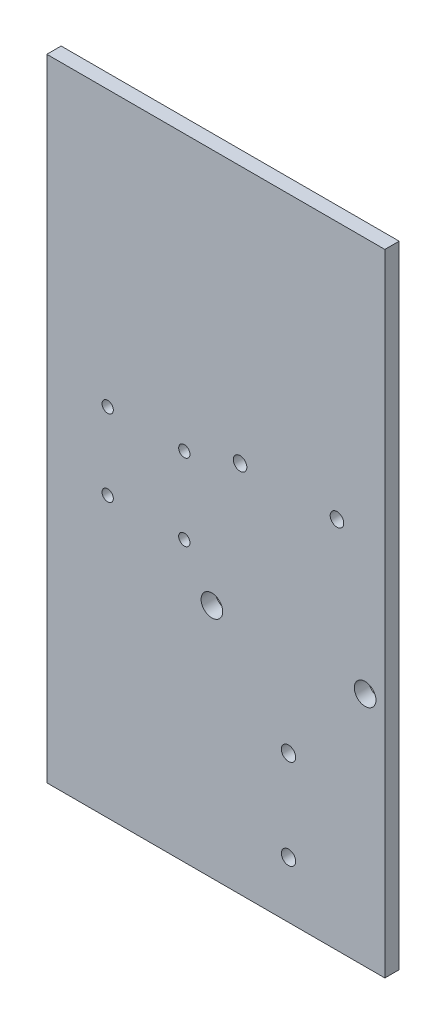
ISO-10303-21;
HEADER;
FILE_DESCRIPTION(('STEP AP214'),'2;1');
FILE_NAME('part.step','',(''),(''),'','','');
FILE_SCHEMA(('AUTOMOTIVE_DESIGN { 1 0 10303 214 1 1 1 1 }'));
ENDSEC;
DATA;
#1=APPLICATION_CONTEXT('core data for automotive mechanical design processes');
#2=APPLICATION_PROTOCOL_DEFINITION('international standard','automotive_design',2000,#1);
#3=PRODUCT_CONTEXT('',#1,'mechanical');
#4=PRODUCT('Part','Part','',(#3));
#5=PRODUCT_RELATED_PRODUCT_CATEGORY('part','',(#4));
#6=PRODUCT_DEFINITION_FORMATION('','',#4);
#7=PRODUCT_DEFINITION_CONTEXT('part definition',#1,'design');
#8=PRODUCT_DEFINITION('design','',#6,#7);
#9=PRODUCT_DEFINITION_SHAPE('','',#8);
#10=(LENGTH_UNIT() NAMED_UNIT(*) SI_UNIT(.MILLI.,.METRE.));
#11=(NAMED_UNIT(*) PLANE_ANGLE_UNIT() SI_UNIT($,.RADIAN.));
#12=(NAMED_UNIT(*) SI_UNIT($,.STERADIAN.) SOLID_ANGLE_UNIT());
#13=UNCERTAINTY_MEASURE_WITH_UNIT(LENGTH_MEASURE(1.E-05),#10,'distance_accuracy_value','');
#14=(GEOMETRIC_REPRESENTATION_CONTEXT(3) GLOBAL_UNCERTAINTY_ASSIGNED_CONTEXT((#13)) GLOBAL_UNIT_ASSIGNED_CONTEXT((#10,
#11,#12)) REPRESENTATION_CONTEXT('',''));
#15=CARTESIAN_POINT('',(0.,0.,0.));
#16=DIRECTION('',(0.,0.,1.));
#17=DIRECTION('',(1.,0.,0.));
#18=AXIS2_PLACEMENT_3D('',#15,#16,#17);
#19=CARTESIAN_POINT('',(0.,0.,6.35));
#20=DIRECTION('',(1.,0.,0.));
#21=DIRECTION('',(0.,1.,0.));
#22=AXIS2_PLACEMENT_3D('',#19,#20,#21);
#23=PLANE('',#22);
#24=DIRECTION('',(0.,-1.,0.));
#25=VECTOR('',#24,1.);
#26=CARTESIAN_POINT('',(0.,0.,0.));
#27=LINE('',#26,#25);
#28=CARTESIAN_POINT('',(0.,280.,0.));
#29=VERTEX_POINT('',#28);
#30=CARTESIAN_POINT('',(0.,0.,0.));
#31=VERTEX_POINT('',#30);
#32=EDGE_CURVE('E101',#29,#31,#27,.T.);
#33=ORIENTED_EDGE('',*,*,#32,.T.);
#34=DIRECTION('',(0.,0.,-1.));
#35=VECTOR('',#34,1.);
#36=CARTESIAN_POINT('',(0.,0.,6.35));
#37=LINE('',#36,#35);
#38=CARTESIAN_POINT('',(0.,0.,6.35));
#39=VERTEX_POINT('',#38);
#40=EDGE_CURVE('E11',#39,#31,#37,.T.);
#41=ORIENTED_EDGE('',*,*,#40,.F.);
#42=DIRECTION('',(0.,-1.,0.));
#43=VECTOR('',#42,1.);
#44=CARTESIAN_POINT('',(0.,0.,6.35));
#45=LINE('',#44,#43);
#46=CARTESIAN_POINT('',(0.,280.,6.35));
#47=VERTEX_POINT('',#46);
#48=EDGE_CURVE('E89',#47,#39,#45,.T.);
#49=ORIENTED_EDGE('',*,*,#48,.F.);
#50=DIRECTION('',(0.,0.,-1.));
#51=VECTOR('',#50,1.);
#52=CARTESIAN_POINT('',(0.,280.,6.35));
#53=LINE('',#52,#51);
#54=EDGE_CURVE('E97',#47,#29,#53,.T.);
#55=ORIENTED_EDGE('',*,*,#54,.T.);
#56=EDGE_LOOP('',(#33,#41,#49,#55));
#57=FACE_BOUND('',#56,.T.);
#58=ADVANCED_FACE('F38',(#57),#23,.F.);
#59=CARTESIAN_POINT('',(0.,0.,6.35));
#60=DIRECTION('',(0.,1.,0.));
#61=DIRECTION('',(0.,0.,1.));
#62=AXIS2_PLACEMENT_3D('',#59,#60,#61);
#63=PLANE('',#62);
#64=DIRECTION('',(1.,0.,0.));
#65=VECTOR('',#64,1.);
#66=CARTESIAN_POINT('',(0.,0.,0.));
#67=LINE('',#66,#65);
#68=CARTESIAN_POINT('',(150.,0.,0.));
#69=VERTEX_POINT('',#68);
#70=EDGE_CURVE('E93',#31,#69,#67,.T.);
#71=ORIENTED_EDGE('',*,*,#70,.T.);
#72=DIRECTION('',(0.,0.,-1.));
#73=VECTOR('',#72,1.);
#74=CARTESIAN_POINT('',(150.,0.,6.35));
#75=LINE('',#74,#73);
#76=CARTESIAN_POINT('',(150.,0.,6.35));
#77=VERTEX_POINT('',#76);
#78=EDGE_CURVE('E46',#77,#69,#75,.T.);
#79=ORIENTED_EDGE('',*,*,#78,.F.);
#80=DIRECTION('',(1.,0.,0.));
#81=VECTOR('',#80,1.);
#82=CARTESIAN_POINT('',(0.,0.,6.35));
#83=LINE('',#82,#81);
#84=EDGE_CURVE('E84',#39,#77,#83,.T.);
#85=ORIENTED_EDGE('',*,*,#84,.F.);
#86=ORIENTED_EDGE('',*,*,#40,.T.);
#87=EDGE_LOOP('',(#71,#79,#85,#86));
#88=FACE_BOUND('',#87,.T.);
#89=ADVANCED_FACE('F92',(#88),#63,.F.);
#90=CARTESIAN_POINT('',(150.,0.,6.35));
#91=DIRECTION('',(-1.,0.,0.));
#92=DIRECTION('',(0.,-1.,0.));
#93=AXIS2_PLACEMENT_3D('',#90,#91,#92);
#94=PLANE('',#93);
#95=DIRECTION('',(0.,1.,0.));
#96=VECTOR('',#95,1.);
#97=CARTESIAN_POINT('',(150.,0.,0.));
#98=LINE('',#97,#96);
#99=CARTESIAN_POINT('',(150.,280.,0.));
#100=VERTEX_POINT('',#99);
#101=EDGE_CURVE('E71',#69,#100,#98,.T.);
#102=ORIENTED_EDGE('',*,*,#101,.T.);
#103=DIRECTION('',(0.,0.,-1.));
#104=VECTOR('',#103,1.);
#105=CARTESIAN_POINT('',(150.,280.,6.35));
#106=LINE('',#105,#104);
#107=CARTESIAN_POINT('',(150.,280.,6.35));
#108=VERTEX_POINT('',#107);
#109=EDGE_CURVE('E94',#108,#100,#106,.T.);
#110=ORIENTED_EDGE('',*,*,#109,.F.);
#111=DIRECTION('',(0.,1.,0.));
#112=VECTOR('',#111,1.);
#113=CARTESIAN_POINT('',(150.,0.,6.35));
#114=LINE('',#113,#112);
#115=EDGE_CURVE('E87',#77,#108,#114,.T.);
#116=ORIENTED_EDGE('',*,*,#115,.F.);
#117=ORIENTED_EDGE('',*,*,#78,.T.);
#118=EDGE_LOOP('',(#102,#110,#116,#117));
#119=FACE_BOUND('',#118,.T.);
#120=ADVANCED_FACE('F95',(#119),#94,.F.);
#121=CARTESIAN_POINT('',(0.,280.,6.35));
#122=DIRECTION('',(0.,-1.,0.));
#123=DIRECTION('',(0.,0.,-1.));
#124=AXIS2_PLACEMENT_3D('',#121,#122,#123);
#125=PLANE('',#124);
#126=DIRECTION('',(-1.,0.,0.));
#127=VECTOR('',#126,1.);
#128=CARTESIAN_POINT('',(0.,280.,0.));
#129=LINE('',#128,#127);
#130=EDGE_CURVE('E77',#100,#29,#129,.T.);
#131=ORIENTED_EDGE('',*,*,#130,.T.);
#132=ORIENTED_EDGE('',*,*,#54,.F.);
#133=DIRECTION('',(-1.,0.,0.));
#134=VECTOR('',#133,1.);
#135=CARTESIAN_POINT('',(0.,280.,6.35));
#136=LINE('',#135,#134);
#137=EDGE_CURVE('E54',#108,#47,#136,.T.);
#138=ORIENTED_EDGE('',*,*,#137,.F.);
#139=ORIENTED_EDGE('',*,*,#109,.T.);
#140=EDGE_LOOP('',(#131,#132,#138,#139));
#141=FACE_BOUND('',#140,.T.);
#142=ADVANCED_FACE('F109',(#141),#125,.F.);
#143=CARTESIAN_POINT('',(0.,0.,6.35));
#144=DIRECTION('',(0.,0.,-1.));
#145=DIRECTION('',(-1.,0.,0.));
#146=AXIS2_PLACEMENT_3D('',#143,#144,#145);
#147=PLANE('',#146);
#148=CARTESIAN_POINT('',(60.9999999999992,157.999999999995,6.35));
#149=DIRECTION('',(0.,0.,1.));
#150=DIRECTION('',(1.,0.,0.));
#151=AXIS2_PLACEMENT_3D('',#148,#149,#150);
#152=CIRCLE('',#151,2.5);
#153=CARTESIAN_POINT('',(63.4999999999992,157.999999999995,6.35));
#154=VERTEX_POINT('',#153);
#155=EDGE_CURVE('E157',#154,#154,#152,.T.);
#156=ORIENTED_EDGE('',*,*,#155,.F.);
#157=EDGE_LOOP('',(#156));
#158=FACE_BOUND('',#157,.T.);
#159=CARTESIAN_POINT('',(26.9999999999992,157.999999999995,6.35));
#160=DIRECTION('',(0.,0.,1.));
#161=DIRECTION('',(1.,0.,0.));
#162=AXIS2_PLACEMENT_3D('',#159,#160,#161);
#163=CIRCLE('',#162,2.5);
#164=CARTESIAN_POINT('',(29.4999999999992,157.999999999995,6.35));
#165=VERTEX_POINT('',#164);
#166=EDGE_CURVE('E164',#165,#165,#163,.T.);
#167=ORIENTED_EDGE('',*,*,#166,.F.);
#168=EDGE_LOOP('',(#167));
#169=FACE_BOUND('',#168,.T.);
#170=CARTESIAN_POINT('',(26.9999999999991,123.999999999995,6.35));
#171=DIRECTION('',(0.,0.,1.));
#172=DIRECTION('',(1.,0.,0.));
#173=AXIS2_PLACEMENT_3D('',#170,#171,#172);
#174=CIRCLE('',#173,2.5);
#175=CARTESIAN_POINT('',(29.4999999999991,123.999999999995,6.35));
#176=VERTEX_POINT('',#175);
#177=EDGE_CURVE('E156',#176,#176,#174,.T.);
#178=ORIENTED_EDGE('',*,*,#177,.F.);
#179=EDGE_LOOP('',(#178));
#180=FACE_BOUND('',#179,.T.);
#181=CARTESIAN_POINT('',(60.999999999999,123.999999999995,6.35));
#182=DIRECTION('',(0.,0.,1.));
#183=DIRECTION('',(1.,0.,0.));
#184=AXIS2_PLACEMENT_3D('',#181,#182,#183);
#185=CIRCLE('',#184,2.5);
#186=CARTESIAN_POINT('',(63.499999999999,123.999999999995,6.35));
#187=VERTEX_POINT('',#186);
#188=EDGE_CURVE('E153',#187,#187,#185,.T.);
#189=ORIENTED_EDGE('',*,*,#188,.F.);
#190=EDGE_LOOP('',(#189));
#191=FACE_BOUND('',#190,.T.);
#192=CARTESIAN_POINT('',(107.25,25.,6.35));
#193=DIRECTION('',(0.,0.,-1.));
#194=DIRECTION('',(-1.,0.,0.));
#195=AXIS2_PLACEMENT_3D('',#192,#193,#194);
#196=CIRCLE('',#195,3.17499999999997);
#197=CARTESIAN_POINT('',(104.075,25.,6.35));
#198=VERTEX_POINT('',#197);
#199=EDGE_CURVE('E104',#198,#198,#196,.T.);
#200=ORIENTED_EDGE('',*,*,#199,.T.);
#201=EDGE_LOOP('',(#200));
#202=FACE_BOUND('',#201,.T.);
#203=CARTESIAN_POINT('',(141.25,104.797983851901,6.35));
#204=DIRECTION('',(0.,0.,-1.));
#205=DIRECTION('',(-1.,0.,0.));
#206=AXIS2_PLACEMENT_3D('',#203,#204,#205);
#207=CIRCLE('',#206,4.79999999999997);
#208=CARTESIAN_POINT('',(136.45,104.797983851901,6.35));
#209=VERTEX_POINT('',#208);
#210=EDGE_CURVE('E138',#209,#209,#207,.T.);
#211=ORIENTED_EDGE('',*,*,#210,.T.);
#212=EDGE_LOOP('',(#211));
#213=FACE_BOUND('',#212,.T.);
#214=CARTESIAN_POINT('',(73.25,104.797983851901,6.35));
#215=DIRECTION('',(0.,0.,-1.));
#216=DIRECTION('',(-1.,0.,0.));
#217=AXIS2_PLACEMENT_3D('',#214,#215,#216);
#218=CIRCLE('',#217,4.80000000000003);
#219=CARTESIAN_POINT('',(68.45,104.797983851901,6.35));
#220=VERTEX_POINT('',#219);
#221=EDGE_CURVE('E132',#220,#220,#218,.T.);
#222=ORIENTED_EDGE('',*,*,#221,.T.);
#223=EDGE_LOOP('',(#222));
#224=FACE_BOUND('',#223,.T.);
#225=CARTESIAN_POINT('',(128.750000003196,165.627983851901,6.35));
#226=DIRECTION('',(0.,0.,-1.));
#227=DIRECTION('',(-1.,0.,0.));
#228=AXIS2_PLACEMENT_3D('',#225,#226,#227);
#229=CIRCLE('',#228,2.99999999999999);
#230=CARTESIAN_POINT('',(125.750000003196,165.627983851901,6.35));
#231=VERTEX_POINT('',#230);
#232=EDGE_CURVE('E126',#231,#231,#229,.T.);
#233=ORIENTED_EDGE('',*,*,#232,.T.);
#234=EDGE_LOOP('',(#233));
#235=FACE_BOUND('',#234,.T.);
#236=CARTESIAN_POINT('',(85.7500000031957,165.627983851901,6.35));
#237=DIRECTION('',(0.,0.,-1.));
#238=DIRECTION('',(-1.,0.,0.));
#239=AXIS2_PLACEMENT_3D('',#236,#237,#238);
#240=CIRCLE('',#239,2.99999999999999);
#241=CARTESIAN_POINT('',(82.7500000031957,165.627983851901,6.35));
#242=VERTEX_POINT('',#241);
#243=EDGE_CURVE('E118',#242,#242,#240,.T.);
#244=ORIENTED_EDGE('',*,*,#243,.T.);
#245=EDGE_LOOP('',(#244));
#246=FACE_BOUND('',#245,.T.);
#247=CARTESIAN_POINT('',(107.25,65.,6.35));
#248=DIRECTION('',(0.,0.,-1.));
#249=DIRECTION('',(-1.,0.,0.));
#250=AXIS2_PLACEMENT_3D('',#247,#248,#249);
#251=CIRCLE('',#250,3.17499999999997);
#252=CARTESIAN_POINT('',(104.075,65.,6.35));
#253=VERTEX_POINT('',#252);
#254=EDGE_CURVE('E119',#253,#253,#251,.T.);
#255=ORIENTED_EDGE('',*,*,#254,.T.);
#256=EDGE_LOOP('',(#255));
#257=FACE_BOUND('',#256,.T.);
#258=ORIENTED_EDGE('',*,*,#48,.T.);
#259=ORIENTED_EDGE('',*,*,#84,.T.);
#260=ORIENTED_EDGE('',*,*,#115,.T.);
#261=ORIENTED_EDGE('',*,*,#137,.T.);
#262=EDGE_LOOP('',(#258,#259,#260,#261));
#263=FACE_BOUND('',#262,.T.);
#264=ADVANCED_FACE('F85',(#158,#169,#180,#191,#202,#213,#224,#235,#246,#257,#263),#147,.F.);
#265=CARTESIAN_POINT('',(0.,0.,0.));
#266=DIRECTION('',(0.,0.,-1.));
#267=DIRECTION('',(-1.,0.,0.));
#268=AXIS2_PLACEMENT_3D('',#265,#266,#267);
#269=PLANE('',#268);
#270=CARTESIAN_POINT('',(60.9999999999992,157.999999999995,0.));
#271=DIRECTION('',(0.,0.,-1.));
#272=DIRECTION('',(-1.,0.,0.));
#273=AXIS2_PLACEMENT_3D('',#270,#271,#272);
#274=CIRCLE('',#273,2.5);
#275=CARTESIAN_POINT('',(58.4999999999992,157.999999999995,0.));
#276=VERTEX_POINT('',#275);
#277=EDGE_CURVE('E161',#276,#276,#274,.F.);
#278=ORIENTED_EDGE('',*,*,#277,.T.);
#279=EDGE_LOOP('',(#278));
#280=FACE_BOUND('',#279,.T.);
#281=CARTESIAN_POINT('',(26.9999999999992,157.999999999995,0.));
#282=DIRECTION('',(0.,0.,-1.));
#283=DIRECTION('',(-1.,0.,0.));
#284=AXIS2_PLACEMENT_3D('',#281,#282,#283);
#285=CIRCLE('',#284,2.5);
#286=CARTESIAN_POINT('',(24.4999999999992,157.999999999995,0.));
#287=VERTEX_POINT('',#286);
#288=EDGE_CURVE('E160',#287,#287,#285,.F.);
#289=ORIENTED_EDGE('',*,*,#288,.T.);
#290=EDGE_LOOP('',(#289));
#291=FACE_BOUND('',#290,.T.);
#292=CARTESIAN_POINT('',(26.9999999999991,123.999999999995,0.));
#293=DIRECTION('',(0.,0.,-1.));
#294=DIRECTION('',(-1.,0.,0.));
#295=AXIS2_PLACEMENT_3D('',#292,#293,#294);
#296=CIRCLE('',#295,2.5);
#297=CARTESIAN_POINT('',(24.4999999999991,123.999999999995,0.));
#298=VERTEX_POINT('',#297);
#299=EDGE_CURVE('E167',#298,#298,#296,.F.);
#300=ORIENTED_EDGE('',*,*,#299,.T.);
#301=EDGE_LOOP('',(#300));
#302=FACE_BOUND('',#301,.T.);
#303=CARTESIAN_POINT('',(60.999999999999,123.999999999995,0.));
#304=DIRECTION('',(0.,0.,-1.));
#305=DIRECTION('',(-1.,0.,0.));
#306=AXIS2_PLACEMENT_3D('',#303,#304,#305);
#307=CIRCLE('',#306,2.5);
#308=CARTESIAN_POINT('',(58.499999999999,123.999999999995,0.));
#309=VERTEX_POINT('',#308);
#310=EDGE_CURVE('E122',#309,#309,#307,.F.);
#311=ORIENTED_EDGE('',*,*,#310,.T.);
#312=EDGE_LOOP('',(#311));
#313=FACE_BOUND('',#312,.T.);
#314=CARTESIAN_POINT('',(107.25,25.,0.));
#315=DIRECTION('',(0.,0.,1.));
#316=DIRECTION('',(1.,0.,0.));
#317=AXIS2_PLACEMENT_3D('',#314,#315,#316);
#318=CIRCLE('',#317,3.17499999999997);
#319=CARTESIAN_POINT('',(110.425,25.,0.));
#320=VERTEX_POINT('',#319);
#321=EDGE_CURVE('E144',#320,#320,#318,.T.);
#322=ORIENTED_EDGE('',*,*,#321,.T.);
#323=EDGE_LOOP('',(#322));
#324=FACE_BOUND('',#323,.T.);
#325=CARTESIAN_POINT('',(141.25,104.797983851901,0.));
#326=DIRECTION('',(0.,0.,1.));
#327=DIRECTION('',(1.,0.,0.));
#328=AXIS2_PLACEMENT_3D('',#325,#326,#327);
#329=CIRCLE('',#328,4.79999999999997);
#330=CARTESIAN_POINT('',(146.05,104.797983851901,0.));
#331=VERTEX_POINT('',#330);
#332=EDGE_CURVE('E141',#331,#331,#329,.T.);
#333=ORIENTED_EDGE('',*,*,#332,.T.);
#334=EDGE_LOOP('',(#333));
#335=FACE_BOUND('',#334,.T.);
#336=CARTESIAN_POINT('',(73.25,104.797983851901,0.));
#337=DIRECTION('',(0.,0.,1.));
#338=DIRECTION('',(1.,0.,0.));
#339=AXIS2_PLACEMENT_3D('',#336,#337,#338);
#340=CIRCLE('',#339,4.80000000000003);
#341=CARTESIAN_POINT('',(78.05,104.797983851901,0.));
#342=VERTEX_POINT('',#341);
#343=EDGE_CURVE('E135',#342,#342,#340,.T.);
#344=ORIENTED_EDGE('',*,*,#343,.T.);
#345=EDGE_LOOP('',(#344));
#346=FACE_BOUND('',#345,.T.);
#347=CARTESIAN_POINT('',(128.750000003196,165.627983851901,0.));
#348=DIRECTION('',(0.,0.,1.));
#349=DIRECTION('',(1.,0.,0.));
#350=AXIS2_PLACEMENT_3D('',#347,#348,#349);
#351=CIRCLE('',#350,2.99999999999999);
#352=CARTESIAN_POINT('',(131.750000003196,165.627983851901,0.));
#353=VERTEX_POINT('',#352);
#354=EDGE_CURVE('E129',#353,#353,#351,.T.);
#355=ORIENTED_EDGE('',*,*,#354,.T.);
#356=EDGE_LOOP('',(#355));
#357=FACE_BOUND('',#356,.T.);
#358=CARTESIAN_POINT('',(85.7500000031957,165.627983851901,0.));
#359=DIRECTION('',(0.,0.,1.));
#360=DIRECTION('',(1.,0.,0.));
#361=AXIS2_PLACEMENT_3D('',#358,#359,#360);
#362=CIRCLE('',#361,2.99999999999999);
#363=CARTESIAN_POINT('',(88.7500000031957,165.627983851901,0.));
#364=VERTEX_POINT('',#363);
#365=EDGE_CURVE('E123',#364,#364,#362,.T.);
#366=ORIENTED_EDGE('',*,*,#365,.T.);
#367=EDGE_LOOP('',(#366));
#368=FACE_BOUND('',#367,.T.);
#369=CARTESIAN_POINT('',(107.25,65.,0.));
#370=DIRECTION('',(0.,0.,1.));
#371=DIRECTION('',(1.,0.,0.));
#372=AXIS2_PLACEMENT_3D('',#369,#370,#371);
#373=CIRCLE('',#372,3.17499999999997);
#374=CARTESIAN_POINT('',(110.425,65.,0.));
#375=VERTEX_POINT('',#374);
#376=EDGE_CURVE('E115',#375,#375,#373,.T.);
#377=ORIENTED_EDGE('',*,*,#376,.T.);
#378=EDGE_LOOP('',(#377));
#379=FACE_BOUND('',#378,.T.);
#380=ORIENTED_EDGE('',*,*,#32,.F.);
#381=ORIENTED_EDGE('',*,*,#130,.F.);
#382=ORIENTED_EDGE('',*,*,#101,.F.);
#383=ORIENTED_EDGE('',*,*,#70,.F.);
#384=EDGE_LOOP('',(#380,#381,#382,#383));
#385=FACE_BOUND('',#384,.T.);
#386=ADVANCED_FACE('F112',(#280,#291,#302,#313,#324,#335,#346,#357,#368,#379,#385),#269,.T.);
#387=CARTESIAN_POINT('',(107.25,65.,19.9264501987818));
#388=DIRECTION('',(0.,0.,-1.));
#389=DIRECTION('',(-1.,0.,0.));
#390=AXIS2_PLACEMENT_3D('',#387,#388,#389);
#391=CYLINDRICAL_SURFACE('',#390,3.17499999999997);
#392=ORIENTED_EDGE('',*,*,#254,.F.);
#393=EDGE_LOOP('',(#392));
#394=FACE_BOUND('',#393,.T.);
#395=ORIENTED_EDGE('',*,*,#376,.F.);
#396=EDGE_LOOP('',(#395));
#397=FACE_BOUND('',#396,.T.);
#398=ADVANCED_FACE('F206',(#394,#397),#391,.F.);
#399=CARTESIAN_POINT('',(85.7500000031957,165.627983851901,19.9264501987818));
#400=DIRECTION('',(0.,0.,-1.));
#401=DIRECTION('',(-1.,0.,0.));
#402=AXIS2_PLACEMENT_3D('',#399,#400,#401);
#403=CYLINDRICAL_SURFACE('',#402,2.99999999999999);
#404=ORIENTED_EDGE('',*,*,#243,.F.);
#405=EDGE_LOOP('',(#404));
#406=FACE_BOUND('',#405,.T.);
#407=ORIENTED_EDGE('',*,*,#365,.F.);
#408=EDGE_LOOP('',(#407));
#409=FACE_BOUND('',#408,.T.);
#410=ADVANCED_FACE('F213',(#406,#409),#403,.F.);
#411=CARTESIAN_POINT('',(128.750000003196,165.627983851901,19.9264501987818));
#412=DIRECTION('',(0.,0.,-1.));
#413=DIRECTION('',(-1.,0.,0.));
#414=AXIS2_PLACEMENT_3D('',#411,#412,#413);
#415=CYLINDRICAL_SURFACE('',#414,2.99999999999999);
#416=ORIENTED_EDGE('',*,*,#232,.F.);
#417=EDGE_LOOP('',(#416));
#418=FACE_BOUND('',#417,.T.);
#419=ORIENTED_EDGE('',*,*,#354,.F.);
#420=EDGE_LOOP('',(#419));
#421=FACE_BOUND('',#420,.T.);
#422=ADVANCED_FACE('F217',(#418,#421),#415,.F.);
#423=CARTESIAN_POINT('',(73.25,104.797983851901,19.9264501987818));
#424=DIRECTION('',(0.,0.,-1.));
#425=DIRECTION('',(-1.,0.,0.));
#426=AXIS2_PLACEMENT_3D('',#423,#424,#425);
#427=CYLINDRICAL_SURFACE('',#426,4.80000000000003);
#428=ORIENTED_EDGE('',*,*,#221,.F.);
#429=EDGE_LOOP('',(#428));
#430=FACE_BOUND('',#429,.T.);
#431=ORIENTED_EDGE('',*,*,#343,.F.);
#432=EDGE_LOOP('',(#431));
#433=FACE_BOUND('',#432,.T.);
#434=ADVANCED_FACE('F221',(#430,#433),#427,.F.);
#435=CARTESIAN_POINT('',(141.25,104.797983851901,19.9264501987818));
#436=DIRECTION('',(0.,0.,-1.));
#437=DIRECTION('',(-1.,0.,0.));
#438=AXIS2_PLACEMENT_3D('',#435,#436,#437);
#439=CYLINDRICAL_SURFACE('',#438,4.79999999999997);
#440=ORIENTED_EDGE('',*,*,#210,.F.);
#441=EDGE_LOOP('',(#440));
#442=FACE_BOUND('',#441,.T.);
#443=ORIENTED_EDGE('',*,*,#332,.F.);
#444=EDGE_LOOP('',(#443));
#445=FACE_BOUND('',#444,.T.);
#446=ADVANCED_FACE('F225',(#442,#445),#439,.F.);
#447=CARTESIAN_POINT('',(107.25,25.,19.9264501987818));
#448=DIRECTION('',(0.,0.,-1.));
#449=DIRECTION('',(-1.,0.,0.));
#450=AXIS2_PLACEMENT_3D('',#447,#448,#449);
#451=CYLINDRICAL_SURFACE('',#450,3.17499999999997);
#452=ORIENTED_EDGE('',*,*,#199,.F.);
#453=EDGE_LOOP('',(#452));
#454=FACE_BOUND('',#453,.T.);
#455=ORIENTED_EDGE('',*,*,#321,.F.);
#456=EDGE_LOOP('',(#455));
#457=FACE_BOUND('',#456,.T.);
#458=ADVANCED_FACE('F190',(#454,#457),#451,.F.);
#459=CARTESIAN_POINT('',(60.999999999999,123.999999999995,-7.07106781186548));
#460=DIRECTION('',(0.,0.,1.));
#461=DIRECTION('',(1.,0.,0.));
#462=AXIS2_PLACEMENT_3D('',#459,#460,#461);
#463=CYLINDRICAL_SURFACE('',#462,2.5);
#464=ORIENTED_EDGE('',*,*,#188,.T.);
#465=EDGE_LOOP('',(#464));
#466=FACE_BOUND('',#465,.T.);
#467=ORIENTED_EDGE('',*,*,#310,.F.);
#468=EDGE_LOOP('',(#467));
#469=FACE_BOUND('',#468,.T.);
#470=ADVANCED_FACE('F180',(#466,#469),#463,.F.);
#471=CARTESIAN_POINT('',(26.9999999999991,123.999999999995,-7.07106781186548));
#472=DIRECTION('',(0.,0.,1.));
#473=DIRECTION('',(1.,0.,0.));
#474=AXIS2_PLACEMENT_3D('',#471,#472,#473);
#475=CYLINDRICAL_SURFACE('',#474,2.5);
#476=ORIENTED_EDGE('',*,*,#177,.T.);
#477=EDGE_LOOP('',(#476));
#478=FACE_BOUND('',#477,.T.);
#479=ORIENTED_EDGE('',*,*,#299,.F.);
#480=EDGE_LOOP('',(#479));
#481=FACE_BOUND('',#480,.T.);
#482=ADVANCED_FACE('F177',(#478,#481),#475,.F.);
#483=CARTESIAN_POINT('',(26.9999999999992,157.999999999995,-7.07106781186548));
#484=DIRECTION('',(0.,0.,1.));
#485=DIRECTION('',(1.,0.,0.));
#486=AXIS2_PLACEMENT_3D('',#483,#484,#485);
#487=CYLINDRICAL_SURFACE('',#486,2.5);
#488=ORIENTED_EDGE('',*,*,#166,.T.);
#489=EDGE_LOOP('',(#488));
#490=FACE_BOUND('',#489,.T.);
#491=ORIENTED_EDGE('',*,*,#288,.F.);
#492=EDGE_LOOP('',(#491));
#493=FACE_BOUND('',#492,.T.);
#494=ADVANCED_FACE('F179',(#490,#493),#487,.F.);
#495=CARTESIAN_POINT('',(60.9999999999992,157.999999999995,-7.07106781186548));
#496=DIRECTION('',(0.,0.,1.));
#497=DIRECTION('',(1.,0.,0.));
#498=AXIS2_PLACEMENT_3D('',#495,#496,#497);
#499=CYLINDRICAL_SURFACE('',#498,2.5);
#500=ORIENTED_EDGE('',*,*,#155,.T.);
#501=EDGE_LOOP('',(#500));
#502=FACE_BOUND('',#501,.T.);
#503=ORIENTED_EDGE('',*,*,#277,.F.);
#504=EDGE_LOOP('',(#503));
#505=FACE_BOUND('',#504,.T.);
#506=ADVANCED_FACE('F187',(#502,#505),#499,.F.);
#507=CLOSED_SHELL('',(#58,#89,#120,#142,#264,#386,#398,#410,#422,#434,#446,#458,#470,#482,#494,#506));
#508=MANIFOLD_SOLID_BREP('B2',#507);
#509=ADVANCED_BREP_SHAPE_REPRESENTATION('',(#18,#508),#14);
#510=SHAPE_DEFINITION_REPRESENTATION(#9,#509);
ENDSEC;
END-ISO-10303-21;
